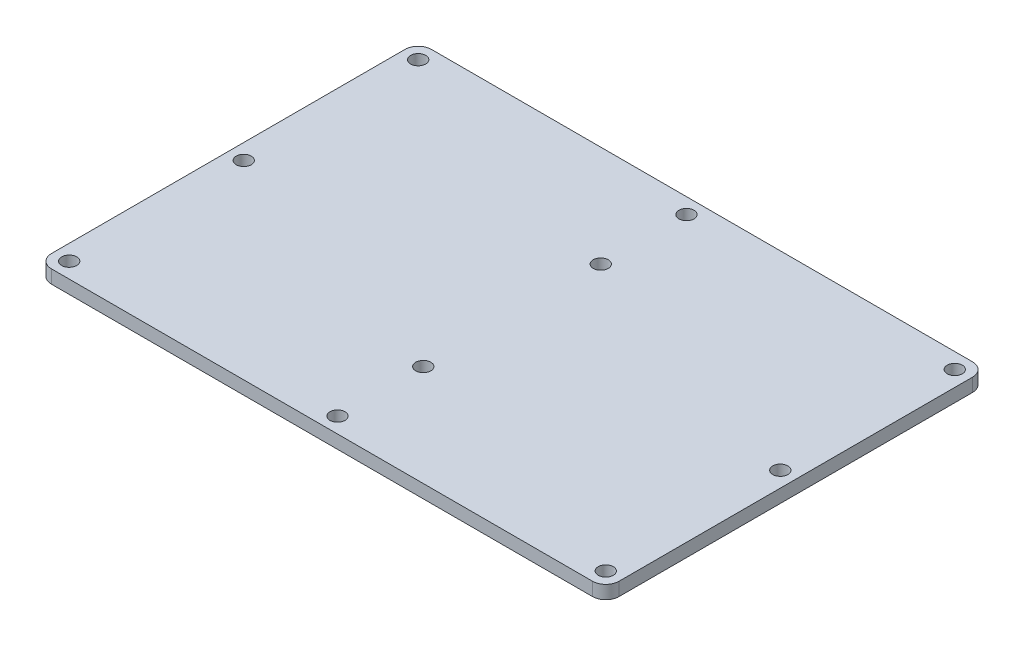
ISO-10303-21;
HEADER;
FILE_DESCRIPTION(('STEP AP214'),'2;1');
FILE_NAME('part.step','',(''),(''),'','','');
FILE_SCHEMA(('AUTOMOTIVE_DESIGN { 1 0 10303 214 1 1 1 1 }'));
ENDSEC;
DATA;
#1=APPLICATION_CONTEXT('core data for automotive mechanical design processes');
#2=APPLICATION_PROTOCOL_DEFINITION('international standard','automotive_design',2000,#1);
#3=PRODUCT_CONTEXT('',#1,'mechanical');
#4=PRODUCT('Part','Part','',(#3));
#5=PRODUCT_RELATED_PRODUCT_CATEGORY('part','',(#4));
#6=PRODUCT_DEFINITION_FORMATION('','',#4);
#7=PRODUCT_DEFINITION_CONTEXT('part definition',#1,'design');
#8=PRODUCT_DEFINITION('design','',#6,#7);
#9=PRODUCT_DEFINITION_SHAPE('','',#8);
#10=(LENGTH_UNIT() NAMED_UNIT(*) SI_UNIT(.MILLI.,.METRE.));
#11=(NAMED_UNIT(*) PLANE_ANGLE_UNIT() SI_UNIT($,.RADIAN.));
#12=(NAMED_UNIT(*) SI_UNIT($,.STERADIAN.) SOLID_ANGLE_UNIT());
#13=UNCERTAINTY_MEASURE_WITH_UNIT(LENGTH_MEASURE(1.E-05),#10,'distance_accuracy_value','');
#14=(GEOMETRIC_REPRESENTATION_CONTEXT(3) GLOBAL_UNCERTAINTY_ASSIGNED_CONTEXT((#13)) GLOBAL_UNIT_ASSIGNED_CONTEXT((#10,
#11,#12)) REPRESENTATION_CONTEXT('',''));
#15=CARTESIAN_POINT('',(0.,0.,0.));
#16=DIRECTION('',(0.,0.,1.));
#17=DIRECTION('',(1.,0.,0.));
#18=AXIS2_PLACEMENT_3D('',#15,#16,#17);
#19=CARTESIAN_POINT('',(0.,0.,0.));
#20=DIRECTION('',(0.,-1.,0.));
#21=DIRECTION('',(0.,0.,-1.));
#22=AXIS2_PLACEMENT_3D('',#19,#20,#21);
#23=PLANE('',#22);
#24=CARTESIAN_POINT('',(-60.5,0.,-39.35));
#25=DIRECTION('',(0.,1.,0.));
#26=DIRECTION('',(0.,0.,1.));
#27=AXIS2_PLACEMENT_3D('',#24,#25,#26);
#28=CIRCLE('',#27,1.7);
#29=CARTESIAN_POINT('',(-60.5,0.,-37.65));
#30=VERTEX_POINT('',#29);
#31=EDGE_CURVE('E282',#30,#30,#28,.T.);
#32=ORIENTED_EDGE('',*,*,#31,.T.);
#33=EDGE_LOOP('',(#32));
#34=FACE_BOUND('',#33,.T.);
#35=CARTESIAN_POINT('',(0.,0.,-39.35));
#36=DIRECTION('',(0.,1.,0.));
#37=DIRECTION('',(0.,0.,1.));
#38=AXIS2_PLACEMENT_3D('',#35,#36,#37);
#39=CIRCLE('',#38,1.7);
#40=CARTESIAN_POINT('',(0.,0.,-37.65));
#41=VERTEX_POINT('',#40);
#42=EDGE_CURVE('E274',#41,#41,#39,.T.);
#43=ORIENTED_EDGE('',*,*,#42,.T.);
#44=EDGE_LOOP('',(#43));
#45=FACE_BOUND('',#44,.T.);
#46=CARTESIAN_POINT('',(60.5,0.,-39.35));
#47=DIRECTION('',(0.,1.,0.));
#48=DIRECTION('',(0.,0.,1.));
#49=AXIS2_PLACEMENT_3D('',#46,#47,#48);
#50=CIRCLE('',#49,1.7);
#51=CARTESIAN_POINT('',(60.5,0.,-37.65));
#52=VERTEX_POINT('',#51);
#53=EDGE_CURVE('E266',#52,#52,#50,.T.);
#54=ORIENTED_EDGE('',*,*,#53,.T.);
#55=EDGE_LOOP('',(#54));
#56=FACE_BOUND('',#55,.T.);
#57=CARTESIAN_POINT('',(60.5,0.,0.));
#58=DIRECTION('',(0.,1.,0.));
#59=DIRECTION('',(0.,0.,1.));
#60=AXIS2_PLACEMENT_3D('',#57,#58,#59);
#61=CIRCLE('',#60,1.7);
#62=CARTESIAN_POINT('',(60.5,0.,1.7));
#63=VERTEX_POINT('',#62);
#64=EDGE_CURVE('E258',#63,#63,#61,.T.);
#65=ORIENTED_EDGE('',*,*,#64,.T.);
#66=EDGE_LOOP('',(#65));
#67=FACE_BOUND('',#66,.T.);
#68=CARTESIAN_POINT('',(60.5,0.,39.35));
#69=DIRECTION('',(0.,1.,0.));
#70=DIRECTION('',(0.,0.,1.));
#71=AXIS2_PLACEMENT_3D('',#68,#69,#70);
#72=CIRCLE('',#71,1.7);
#73=CARTESIAN_POINT('',(60.5,0.,41.05));
#74=VERTEX_POINT('',#73);
#75=EDGE_CURVE('E250',#74,#74,#72,.T.);
#76=ORIENTED_EDGE('',*,*,#75,.T.);
#77=EDGE_LOOP('',(#76));
#78=FACE_BOUND('',#77,.T.);
#79=CARTESIAN_POINT('',(0.,0.,39.35));
#80=DIRECTION('',(0.,1.,0.));
#81=DIRECTION('',(0.,0.,1.));
#82=AXIS2_PLACEMENT_3D('',#79,#80,#81);
#83=CIRCLE('',#82,1.7);
#84=CARTESIAN_POINT('',(0.,0.,41.05));
#85=VERTEX_POINT('',#84);
#86=EDGE_CURVE('E242',#85,#85,#83,.T.);
#87=ORIENTED_EDGE('',*,*,#86,.T.);
#88=EDGE_LOOP('',(#87));
#89=FACE_BOUND('',#88,.T.);
#90=CARTESIAN_POINT('',(-60.5,0.,39.35));
#91=DIRECTION('',(0.,1.,0.));
#92=DIRECTION('',(0.,0.,1.));
#93=AXIS2_PLACEMENT_3D('',#90,#91,#92);
#94=CIRCLE('',#93,1.7);
#95=CARTESIAN_POINT('',(-60.5,0.,41.05));
#96=VERTEX_POINT('',#95);
#97=EDGE_CURVE('E234',#96,#96,#94,.T.);
#98=ORIENTED_EDGE('',*,*,#97,.T.);
#99=EDGE_LOOP('',(#98));
#100=FACE_BOUND('',#99,.T.);
#101=DIRECTION('',(-1.,0.,0.));
#102=VECTOR('',#101,1.);
#103=CARTESIAN_POINT('',(-64.,0.,-42.85));
#104=LINE('',#103,#102);
#105=CARTESIAN_POINT('',(61.,0.,-42.85));
#106=VERTEX_POINT('',#105);
#107=CARTESIAN_POINT('',(-61.,0.,-42.85));
#108=VERTEX_POINT('',#107);
#109=EDGE_CURVE('E125',#106,#108,#104,.T.);
#110=ORIENTED_EDGE('',*,*,#109,.F.);
#111=CARTESIAN_POINT('',(61.,0.,-39.85));
#112=DIRECTION('',(0.,-1.,0.));
#113=DIRECTION('',(0.,0.,-1.));
#114=AXIS2_PLACEMENT_3D('',#111,#112,#113);
#115=CIRCLE('',#114,3.);
#116=CARTESIAN_POINT('',(64.,0.,-39.85));
#117=VERTEX_POINT('',#116);
#118=EDGE_CURVE('E107',#106,#117,#115,.T.);
#119=ORIENTED_EDGE('',*,*,#118,.T.);
#120=DIRECTION('',(0.,0.,-1.));
#121=VECTOR('',#120,1.);
#122=CARTESIAN_POINT('',(64.,0.,42.85));
#123=LINE('',#122,#121);
#124=CARTESIAN_POINT('',(64.,0.,39.85));
#125=VERTEX_POINT('',#124);
#126=EDGE_CURVE('E138',#125,#117,#123,.T.);
#127=ORIENTED_EDGE('',*,*,#126,.F.);
#128=CARTESIAN_POINT('',(61.,0.,39.85));
#129=DIRECTION('',(0.,-1.,0.));
#130=DIRECTION('',(0.,0.,-1.));
#131=AXIS2_PLACEMENT_3D('',#128,#129,#130);
#132=CIRCLE('',#131,3.);
#133=CARTESIAN_POINT('',(61.,0.,42.85));
#134=VERTEX_POINT('',#133);
#135=EDGE_CURVE('E119',#125,#134,#132,.T.);
#136=ORIENTED_EDGE('',*,*,#135,.T.);
#137=DIRECTION('',(1.,0.,0.));
#138=VECTOR('',#137,1.);
#139=CARTESIAN_POINT('',(-64.,0.,42.85));
#140=LINE('',#139,#138);
#141=CARTESIAN_POINT('',(-61.,0.,42.85));
#142=VERTEX_POINT('',#141);
#143=EDGE_CURVE('E143',#142,#134,#140,.T.);
#144=ORIENTED_EDGE('',*,*,#143,.F.);
#145=CARTESIAN_POINT('',(-61.,0.,39.85));
#146=DIRECTION('',(0.,-1.,0.));
#147=DIRECTION('',(0.,0.,-1.));
#148=AXIS2_PLACEMENT_3D('',#145,#146,#147);
#149=CIRCLE('',#148,3.);
#150=CARTESIAN_POINT('',(-64.,0.,39.85));
#151=VERTEX_POINT('',#150);
#152=EDGE_CURVE('E130',#142,#151,#149,.T.);
#153=ORIENTED_EDGE('',*,*,#152,.T.);
#154=DIRECTION('',(0.,0.,1.));
#155=VECTOR('',#154,1.);
#156=CARTESIAN_POINT('',(-64.,0.,42.85));
#157=LINE('',#156,#155);
#158=CARTESIAN_POINT('',(-64.,0.,-39.85));
#159=VERTEX_POINT('',#158);
#160=EDGE_CURVE('E137',#159,#151,#157,.T.);
#161=ORIENTED_EDGE('',*,*,#160,.F.);
#162=CARTESIAN_POINT('',(-61.,0.,-39.85));
#163=DIRECTION('',(0.,-1.,0.));
#164=DIRECTION('',(0.,0.,-1.));
#165=AXIS2_PLACEMENT_3D('',#162,#163,#164);
#166=CIRCLE('',#165,3.);
#167=EDGE_CURVE('E135',#159,#108,#166,.T.);
#168=ORIENTED_EDGE('',*,*,#167,.T.);
#169=EDGE_LOOP('',(#110,#119,#127,#136,#144,#153,#161,#168));
#170=FACE_BOUND('',#169,.T.);
#171=CARTESIAN_POINT('',(0.,0.,-20.01));
#172=DIRECTION('',(0.,1.,0.));
#173=DIRECTION('',(0.,0.,1.));
#174=AXIS2_PLACEMENT_3D('',#171,#172,#173);
#175=CIRCLE('',#174,1.7);
#176=CARTESIAN_POINT('',(0.,0.,-18.31));
#177=VERTEX_POINT('',#176);
#178=EDGE_CURVE('E145',#177,#177,#175,.T.);
#179=ORIENTED_EDGE('',*,*,#178,.T.);
#180=EDGE_LOOP('',(#179));
#181=FACE_BOUND('',#180,.T.);
#182=CARTESIAN_POINT('',(0.,0.,20.01));
#183=DIRECTION('',(0.,1.,0.));
#184=DIRECTION('',(0.,0.,1.));
#185=AXIS2_PLACEMENT_3D('',#182,#183,#184);
#186=CIRCLE('',#185,1.7);
#187=CARTESIAN_POINT('',(0.,0.,21.71));
#188=VERTEX_POINT('',#187);
#189=EDGE_CURVE('E218',#188,#188,#186,.T.);
#190=ORIENTED_EDGE('',*,*,#189,.T.);
#191=EDGE_LOOP('',(#190));
#192=FACE_BOUND('',#191,.T.);
#193=CARTESIAN_POINT('',(-60.5,0.,0.));
#194=DIRECTION('',(0.,1.,0.));
#195=DIRECTION('',(0.,0.,1.));
#196=AXIS2_PLACEMENT_3D('',#193,#194,#195);
#197=CIRCLE('',#196,1.7);
#198=CARTESIAN_POINT('',(-60.5,0.,1.7));
#199=VERTEX_POINT('',#198);
#200=EDGE_CURVE('E226',#199,#199,#197,.T.);
#201=ORIENTED_EDGE('',*,*,#200,.T.);
#202=EDGE_LOOP('',(#201));
#203=FACE_BOUND('',#202,.T.);
#204=ADVANCED_FACE('F39',(#34,#45,#56,#67,#78,#89,#100,#170,#181,#192,#203),#23,.T.);
#205=CARTESIAN_POINT('',(64.,3.,42.85));
#206=DIRECTION('',(-1.,0.,0.));
#207=DIRECTION('',(0.,0.,1.));
#208=AXIS2_PLACEMENT_3D('',#205,#206,#207);
#209=PLANE('',#208);
#210=ORIENTED_EDGE('',*,*,#126,.T.);
#211=DIRECTION('',(0.,-1.,0.));
#212=VECTOR('',#211,1.);
#213=CARTESIAN_POINT('',(64.,3.,-39.85));
#214=LINE('',#213,#212);
#215=CARTESIAN_POINT('',(64.,3.,-39.85));
#216=VERTEX_POINT('',#215);
#217=EDGE_CURVE('E112',#117,#216,#214,.F.);
#218=ORIENTED_EDGE('',*,*,#217,.T.);
#219=DIRECTION('',(0.,0.,-1.));
#220=VECTOR('',#219,1.);
#221=CARTESIAN_POINT('',(64.,3.,42.85));
#222=LINE('',#221,#220);
#223=CARTESIAN_POINT('',(64.,3.,39.85));
#224=VERTEX_POINT('',#223);
#225=EDGE_CURVE('E151',#224,#216,#222,.T.);
#226=ORIENTED_EDGE('',*,*,#225,.F.);
#227=DIRECTION('',(0.,-1.,0.));
#228=VECTOR('',#227,1.);
#229=CARTESIAN_POINT('',(64.,3.,39.85));
#230=LINE('',#229,#228);
#231=EDGE_CURVE('E118',#224,#125,#230,.T.);
#232=ORIENTED_EDGE('',*,*,#231,.T.);
#233=EDGE_LOOP('',(#210,#218,#226,#232));
#234=FACE_BOUND('',#233,.T.);
#235=ADVANCED_FACE('F204',(#234),#209,.F.);
#236=CARTESIAN_POINT('',(-64.,3.,-42.85));
#237=DIRECTION('',(0.,0.,1.));
#238=DIRECTION('',(1.,0.,0.));
#239=AXIS2_PLACEMENT_3D('',#236,#237,#238);
#240=PLANE('',#239);
#241=DIRECTION('',(-1.,0.,0.));
#242=VECTOR('',#241,1.);
#243=CARTESIAN_POINT('',(-64.,3.,-42.85));
#244=LINE('',#243,#242);
#245=CARTESIAN_POINT('',(61.,3.,-42.85));
#246=VERTEX_POINT('',#245);
#247=CARTESIAN_POINT('',(-61.,3.,-42.85));
#248=VERTEX_POINT('',#247);
#249=EDGE_CURVE('E128',#246,#248,#244,.T.);
#250=ORIENTED_EDGE('',*,*,#249,.F.);
#251=DIRECTION('',(0.,-1.,0.));
#252=VECTOR('',#251,1.);
#253=CARTESIAN_POINT('',(61.,3.,-42.85));
#254=LINE('',#253,#252);
#255=EDGE_CURVE('E111',#246,#106,#254,.T.);
#256=ORIENTED_EDGE('',*,*,#255,.T.);
#257=ORIENTED_EDGE('',*,*,#109,.T.);
#258=DIRECTION('',(0.,-1.,0.));
#259=VECTOR('',#258,1.);
#260=CARTESIAN_POINT('',(-61.,3.,-42.85));
#261=LINE('',#260,#259);
#262=EDGE_CURVE('E131',#108,#248,#261,.F.);
#263=ORIENTED_EDGE('',*,*,#262,.T.);
#264=EDGE_LOOP('',(#250,#256,#257,#263));
#265=FACE_BOUND('',#264,.T.);
#266=ADVANCED_FACE('F124',(#265),#240,.F.);
#267=CARTESIAN_POINT('',(-64.,3.,42.85));
#268=DIRECTION('',(1.,0.,0.));
#269=DIRECTION('',(0.,0.,-1.));
#270=AXIS2_PLACEMENT_3D('',#267,#268,#269);
#271=PLANE('',#270);
#272=DIRECTION('',(0.,0.,1.));
#273=VECTOR('',#272,1.);
#274=CARTESIAN_POINT('',(-64.,3.,42.85));
#275=LINE('',#274,#273);
#276=CARTESIAN_POINT('',(-64.,3.,-39.85));
#277=VERTEX_POINT('',#276);
#278=CARTESIAN_POINT('',(-64.,3.,39.85));
#279=VERTEX_POINT('',#278);
#280=EDGE_CURVE('E187',#277,#279,#275,.T.);
#281=ORIENTED_EDGE('',*,*,#280,.F.);
#282=DIRECTION('',(0.,-1.,0.));
#283=VECTOR('',#282,1.);
#284=CARTESIAN_POINT('',(-64.,3.,-39.85));
#285=LINE('',#284,#283);
#286=EDGE_CURVE('E11',#277,#159,#285,.T.);
#287=ORIENTED_EDGE('',*,*,#286,.T.);
#288=ORIENTED_EDGE('',*,*,#160,.T.);
#289=DIRECTION('',(0.,-1.,0.));
#290=VECTOR('',#289,1.);
#291=CARTESIAN_POINT('',(-64.,3.,39.85));
#292=LINE('',#291,#290);
#293=EDGE_CURVE('E48',#151,#279,#292,.F.);
#294=ORIENTED_EDGE('',*,*,#293,.T.);
#295=EDGE_LOOP('',(#281,#287,#288,#294));
#296=FACE_BOUND('',#295,.T.);
#297=ADVANCED_FACE('F186',(#296),#271,.F.);
#298=CARTESIAN_POINT('',(-64.,3.,42.85));
#299=DIRECTION('',(0.,0.,-1.));
#300=DIRECTION('',(-1.,0.,0.));
#301=AXIS2_PLACEMENT_3D('',#298,#299,#300);
#302=PLANE('',#301);
#303=ORIENTED_EDGE('',*,*,#143,.T.);
#304=DIRECTION('',(0.,-1.,0.));
#305=VECTOR('',#304,1.);
#306=CARTESIAN_POINT('',(61.,3.,42.85));
#307=LINE('',#306,#305);
#308=CARTESIAN_POINT('',(61.,3.,42.85));
#309=VERTEX_POINT('',#308);
#310=EDGE_CURVE('E55',#134,#309,#307,.F.);
#311=ORIENTED_EDGE('',*,*,#310,.T.);
#312=DIRECTION('',(1.,0.,0.));
#313=VECTOR('',#312,1.);
#314=CARTESIAN_POINT('',(-64.,3.,42.85));
#315=LINE('',#314,#313);
#316=CARTESIAN_POINT('',(-61.,3.,42.85));
#317=VERTEX_POINT('',#316);
#318=EDGE_CURVE('E153',#317,#309,#315,.T.);
#319=ORIENTED_EDGE('',*,*,#318,.F.);
#320=DIRECTION('',(0.,-1.,0.));
#321=VECTOR('',#320,1.);
#322=CARTESIAN_POINT('',(-61.,3.,42.85));
#323=LINE('',#322,#321);
#324=EDGE_CURVE('E177',#317,#142,#323,.T.);
#325=ORIENTED_EDGE('',*,*,#324,.T.);
#326=EDGE_LOOP('',(#303,#311,#319,#325));
#327=FACE_BOUND('',#326,.T.);
#328=ADVANCED_FACE('F197',(#327),#302,.F.);
#329=CARTESIAN_POINT('',(0.,3.,0.));
#330=DIRECTION('',(0.,-1.,0.));
#331=DIRECTION('',(0.,0.,-1.));
#332=AXIS2_PLACEMENT_3D('',#329,#330,#331);
#333=PLANE('',#332);
#334=CARTESIAN_POINT('',(-60.5,3.,-39.35));
#335=DIRECTION('',(0.,1.,0.));
#336=DIRECTION('',(0.,0.,1.));
#337=AXIS2_PLACEMENT_3D('',#334,#335,#336);
#338=CIRCLE('',#337,1.7);
#339=CARTESIAN_POINT('',(-60.5,3.,-37.65));
#340=VERTEX_POINT('',#339);
#341=EDGE_CURVE('E286',#340,#340,#338,.T.);
#342=ORIENTED_EDGE('',*,*,#341,.F.);
#343=EDGE_LOOP('',(#342));
#344=FACE_BOUND('',#343,.T.);
#345=CARTESIAN_POINT('',(0.,3.,-39.35));
#346=DIRECTION('',(0.,1.,0.));
#347=DIRECTION('',(0.,0.,1.));
#348=AXIS2_PLACEMENT_3D('',#345,#346,#347);
#349=CIRCLE('',#348,1.7);
#350=CARTESIAN_POINT('',(0.,3.,-37.65));
#351=VERTEX_POINT('',#350);
#352=EDGE_CURVE('E278',#351,#351,#349,.T.);
#353=ORIENTED_EDGE('',*,*,#352,.F.);
#354=EDGE_LOOP('',(#353));
#355=FACE_BOUND('',#354,.T.);
#356=CARTESIAN_POINT('',(60.5,3.,-39.35));
#357=DIRECTION('',(0.,1.,0.));
#358=DIRECTION('',(0.,0.,1.));
#359=AXIS2_PLACEMENT_3D('',#356,#357,#358);
#360=CIRCLE('',#359,1.7);
#361=CARTESIAN_POINT('',(60.5,3.,-37.65));
#362=VERTEX_POINT('',#361);
#363=EDGE_CURVE('E270',#362,#362,#360,.T.);
#364=ORIENTED_EDGE('',*,*,#363,.F.);
#365=EDGE_LOOP('',(#364));
#366=FACE_BOUND('',#365,.T.);
#367=CARTESIAN_POINT('',(60.5,3.,0.));
#368=DIRECTION('',(0.,1.,0.));
#369=DIRECTION('',(0.,0.,1.));
#370=AXIS2_PLACEMENT_3D('',#367,#368,#369);
#371=CIRCLE('',#370,1.7);
#372=CARTESIAN_POINT('',(60.5,3.,1.7));
#373=VERTEX_POINT('',#372);
#374=EDGE_CURVE('E262',#373,#373,#371,.T.);
#375=ORIENTED_EDGE('',*,*,#374,.F.);
#376=EDGE_LOOP('',(#375));
#377=FACE_BOUND('',#376,.T.);
#378=CARTESIAN_POINT('',(60.5,3.,39.35));
#379=DIRECTION('',(0.,1.,0.));
#380=DIRECTION('',(0.,0.,1.));
#381=AXIS2_PLACEMENT_3D('',#378,#379,#380);
#382=CIRCLE('',#381,1.7);
#383=CARTESIAN_POINT('',(60.5,3.,41.05));
#384=VERTEX_POINT('',#383);
#385=EDGE_CURVE('E254',#384,#384,#382,.T.);
#386=ORIENTED_EDGE('',*,*,#385,.F.);
#387=EDGE_LOOP('',(#386));
#388=FACE_BOUND('',#387,.T.);
#389=CARTESIAN_POINT('',(0.,3.,39.35));
#390=DIRECTION('',(0.,1.,0.));
#391=DIRECTION('',(0.,0.,1.));
#392=AXIS2_PLACEMENT_3D('',#389,#390,#391);
#393=CIRCLE('',#392,1.7);
#394=CARTESIAN_POINT('',(0.,3.,41.05));
#395=VERTEX_POINT('',#394);
#396=EDGE_CURVE('E246',#395,#395,#393,.T.);
#397=ORIENTED_EDGE('',*,*,#396,.F.);
#398=EDGE_LOOP('',(#397));
#399=FACE_BOUND('',#398,.T.);
#400=CARTESIAN_POINT('',(-60.5,3.,39.35));
#401=DIRECTION('',(0.,1.,0.));
#402=DIRECTION('',(0.,0.,1.));
#403=AXIS2_PLACEMENT_3D('',#400,#401,#402);
#404=CIRCLE('',#403,1.7);
#405=CARTESIAN_POINT('',(-60.5,3.,41.05));
#406=VERTEX_POINT('',#405);
#407=EDGE_CURVE('E238',#406,#406,#404,.T.);
#408=ORIENTED_EDGE('',*,*,#407,.F.);
#409=EDGE_LOOP('',(#408));
#410=FACE_BOUND('',#409,.T.);
#411=CARTESIAN_POINT('',(-60.5,3.,0.));
#412=DIRECTION('',(0.,1.,0.));
#413=DIRECTION('',(0.,0.,1.));
#414=AXIS2_PLACEMENT_3D('',#411,#412,#413);
#415=CIRCLE('',#414,1.7);
#416=CARTESIAN_POINT('',(-60.5,3.,1.7));
#417=VERTEX_POINT('',#416);
#418=EDGE_CURVE('E230',#417,#417,#415,.T.);
#419=ORIENTED_EDGE('',*,*,#418,.F.);
#420=EDGE_LOOP('',(#419));
#421=FACE_BOUND('',#420,.T.);
#422=CARTESIAN_POINT('',(0.,3.,20.01));
#423=DIRECTION('',(0.,1.,0.));
#424=DIRECTION('',(0.,0.,1.));
#425=AXIS2_PLACEMENT_3D('',#422,#423,#424);
#426=CIRCLE('',#425,1.7);
#427=CARTESIAN_POINT('',(0.,3.,21.71));
#428=VERTEX_POINT('',#427);
#429=EDGE_CURVE('E222',#428,#428,#426,.T.);
#430=ORIENTED_EDGE('',*,*,#429,.F.);
#431=EDGE_LOOP('',(#430));
#432=FACE_BOUND('',#431,.T.);
#433=CARTESIAN_POINT('',(0.,3.,-20.01));
#434=DIRECTION('',(0.,1.,0.));
#435=DIRECTION('',(0.,0.,1.));
#436=AXIS2_PLACEMENT_3D('',#433,#434,#435);
#437=CIRCLE('',#436,1.7);
#438=CARTESIAN_POINT('',(0.,3.,-18.31));
#439=VERTEX_POINT('',#438);
#440=EDGE_CURVE('E214',#439,#439,#437,.T.);
#441=ORIENTED_EDGE('',*,*,#440,.F.);
#442=EDGE_LOOP('',(#441));
#443=FACE_BOUND('',#442,.T.);
#444=ORIENTED_EDGE('',*,*,#225,.T.);
#445=CARTESIAN_POINT('',(61.,3.,-39.85));
#446=DIRECTION('',(0.,-1.,0.));
#447=DIRECTION('',(0.,0.,-1.));
#448=AXIS2_PLACEMENT_3D('',#445,#446,#447);
#449=CIRCLE('',#448,3.);
#450=EDGE_CURVE('E174',#216,#246,#449,.F.);
#451=ORIENTED_EDGE('',*,*,#450,.T.);
#452=ORIENTED_EDGE('',*,*,#249,.T.);
#453=CARTESIAN_POINT('',(-61.,3.,-39.85));
#454=DIRECTION('',(0.,-1.,0.));
#455=DIRECTION('',(0.,0.,-1.));
#456=AXIS2_PLACEMENT_3D('',#453,#454,#455);
#457=CIRCLE('',#456,3.);
#458=EDGE_CURVE('E168',#248,#277,#457,.F.);
#459=ORIENTED_EDGE('',*,*,#458,.T.);
#460=ORIENTED_EDGE('',*,*,#280,.T.);
#461=CARTESIAN_POINT('',(-61.,3.,39.85));
#462=DIRECTION('',(0.,-1.,0.));
#463=DIRECTION('',(0.,0.,-1.));
#464=AXIS2_PLACEMENT_3D('',#461,#462,#463);
#465=CIRCLE('',#464,3.);
#466=EDGE_CURVE('E62',#279,#317,#465,.F.);
#467=ORIENTED_EDGE('',*,*,#466,.T.);
#468=ORIENTED_EDGE('',*,*,#318,.T.);
#469=CARTESIAN_POINT('',(61.,3.,39.85));
#470=DIRECTION('',(0.,-1.,0.));
#471=DIRECTION('',(0.,0.,-1.));
#472=AXIS2_PLACEMENT_3D('',#469,#470,#471);
#473=CIRCLE('',#472,3.);
#474=EDGE_CURVE('E171',#309,#224,#473,.F.);
#475=ORIENTED_EDGE('',*,*,#474,.T.);
#476=EDGE_LOOP('',(#444,#451,#452,#459,#460,#467,#468,#475));
#477=FACE_BOUND('',#476,.T.);
#478=ADVANCED_FACE('F191',(#344,#355,#366,#377,#388,#399,#410,#421,#432,#443,#477),#333,.F.);
#479=CARTESIAN_POINT('',(0.,3.,-20.01));
#480=DIRECTION('',(0.,1.,0.));
#481=DIRECTION('',(0.,0.,1.));
#482=AXIS2_PLACEMENT_3D('',#479,#480,#481);
#483=CYLINDRICAL_SURFACE('',#482,1.7);
#484=ORIENTED_EDGE('',*,*,#178,.F.);
#485=EDGE_LOOP('',(#484));
#486=FACE_BOUND('',#485,.T.);
#487=ORIENTED_EDGE('',*,*,#440,.T.);
#488=EDGE_LOOP('',(#487));
#489=FACE_BOUND('',#488,.T.);
#490=ADVANCED_FACE('F295',(#486,#489),#483,.F.);
#491=CARTESIAN_POINT('',(0.,3.,20.01));
#492=DIRECTION('',(0.,1.,0.));
#493=DIRECTION('',(0.,0.,1.));
#494=AXIS2_PLACEMENT_3D('',#491,#492,#493);
#495=CYLINDRICAL_SURFACE('',#494,1.7);
#496=ORIENTED_EDGE('',*,*,#189,.F.);
#497=EDGE_LOOP('',(#496));
#498=FACE_BOUND('',#497,.T.);
#499=ORIENTED_EDGE('',*,*,#429,.T.);
#500=EDGE_LOOP('',(#499));
#501=FACE_BOUND('',#500,.T.);
#502=ADVANCED_FACE('F316',(#498,#501),#495,.F.);
#503=CARTESIAN_POINT('',(-60.5,3.,0.));
#504=DIRECTION('',(0.,1.,0.));
#505=DIRECTION('',(0.,0.,1.));
#506=AXIS2_PLACEMENT_3D('',#503,#504,#505);
#507=CYLINDRICAL_SURFACE('',#506,1.7);
#508=ORIENTED_EDGE('',*,*,#200,.F.);
#509=EDGE_LOOP('',(#508));
#510=FACE_BOUND('',#509,.T.);
#511=ORIENTED_EDGE('',*,*,#418,.T.);
#512=EDGE_LOOP('',(#511));
#513=FACE_BOUND('',#512,.T.);
#514=ADVANCED_FACE('F322',(#510,#513),#507,.F.);
#515=CARTESIAN_POINT('',(-60.5,3.,39.35));
#516=DIRECTION('',(0.,1.,0.));
#517=DIRECTION('',(0.,0.,1.));
#518=AXIS2_PLACEMENT_3D('',#515,#516,#517);
#519=CYLINDRICAL_SURFACE('',#518,1.7);
#520=ORIENTED_EDGE('',*,*,#97,.F.);
#521=EDGE_LOOP('',(#520));
#522=FACE_BOUND('',#521,.T.);
#523=ORIENTED_EDGE('',*,*,#407,.T.);
#524=EDGE_LOOP('',(#523));
#525=FACE_BOUND('',#524,.T.);
#526=ADVANCED_FACE('F462',(#522,#525),#519,.F.);
#527=CARTESIAN_POINT('',(0.,3.,39.35));
#528=DIRECTION('',(0.,1.,0.));
#529=DIRECTION('',(0.,0.,1.));
#530=AXIS2_PLACEMENT_3D('',#527,#528,#529);
#531=CYLINDRICAL_SURFACE('',#530,1.7);
#532=ORIENTED_EDGE('',*,*,#86,.F.);
#533=EDGE_LOOP('',(#532));
#534=FACE_BOUND('',#533,.T.);
#535=ORIENTED_EDGE('',*,*,#396,.T.);
#536=EDGE_LOOP('',(#535));
#537=FACE_BOUND('',#536,.T.);
#538=ADVANCED_FACE('F452',(#534,#537),#531,.F.);
#539=CARTESIAN_POINT('',(60.5,3.,39.35));
#540=DIRECTION('',(0.,1.,0.));
#541=DIRECTION('',(0.,0.,1.));
#542=AXIS2_PLACEMENT_3D('',#539,#540,#541);
#543=CYLINDRICAL_SURFACE('',#542,1.7);
#544=ORIENTED_EDGE('',*,*,#75,.F.);
#545=EDGE_LOOP('',(#544));
#546=FACE_BOUND('',#545,.T.);
#547=ORIENTED_EDGE('',*,*,#385,.T.);
#548=EDGE_LOOP('',(#547));
#549=FACE_BOUND('',#548,.T.);
#550=ADVANCED_FACE('F442',(#546,#549),#543,.F.);
#551=CARTESIAN_POINT('',(60.5,3.,0.));
#552=DIRECTION('',(0.,1.,0.));
#553=DIRECTION('',(0.,0.,1.));
#554=AXIS2_PLACEMENT_3D('',#551,#552,#553);
#555=CYLINDRICAL_SURFACE('',#554,1.7);
#556=ORIENTED_EDGE('',*,*,#64,.F.);
#557=EDGE_LOOP('',(#556));
#558=FACE_BOUND('',#557,.T.);
#559=ORIENTED_EDGE('',*,*,#374,.T.);
#560=EDGE_LOOP('',(#559));
#561=FACE_BOUND('',#560,.T.);
#562=ADVANCED_FACE('F432',(#558,#561),#555,.F.);
#563=CARTESIAN_POINT('',(60.5,3.,-39.35));
#564=DIRECTION('',(0.,1.,0.));
#565=DIRECTION('',(0.,0.,1.));
#566=AXIS2_PLACEMENT_3D('',#563,#564,#565);
#567=CYLINDRICAL_SURFACE('',#566,1.7);
#568=ORIENTED_EDGE('',*,*,#53,.F.);
#569=EDGE_LOOP('',(#568));
#570=FACE_BOUND('',#569,.T.);
#571=ORIENTED_EDGE('',*,*,#363,.T.);
#572=EDGE_LOOP('',(#571));
#573=FACE_BOUND('',#572,.T.);
#574=ADVANCED_FACE('F422',(#570,#573),#567,.F.);
#575=CARTESIAN_POINT('',(0.,3.,-39.35));
#576=DIRECTION('',(0.,1.,0.));
#577=DIRECTION('',(0.,0.,1.));
#578=AXIS2_PLACEMENT_3D('',#575,#576,#577);
#579=CYLINDRICAL_SURFACE('',#578,1.7);
#580=ORIENTED_EDGE('',*,*,#42,.F.);
#581=EDGE_LOOP('',(#580));
#582=FACE_BOUND('',#581,.T.);
#583=ORIENTED_EDGE('',*,*,#352,.T.);
#584=EDGE_LOOP('',(#583));
#585=FACE_BOUND('',#584,.T.);
#586=ADVANCED_FACE('F412',(#582,#585),#579,.F.);
#587=CARTESIAN_POINT('',(-60.5,3.,-39.35));
#588=DIRECTION('',(0.,1.,0.));
#589=DIRECTION('',(0.,0.,1.));
#590=AXIS2_PLACEMENT_3D('',#587,#588,#589);
#591=CYLINDRICAL_SURFACE('',#590,1.7);
#592=ORIENTED_EDGE('',*,*,#31,.F.);
#593=EDGE_LOOP('',(#592));
#594=FACE_BOUND('',#593,.T.);
#595=ORIENTED_EDGE('',*,*,#341,.T.);
#596=EDGE_LOOP('',(#595));
#597=FACE_BOUND('',#596,.T.);
#598=ADVANCED_FACE('F291',(#594,#597),#591,.F.);
#599=CARTESIAN_POINT('',(61.,3.,-39.85));
#600=DIRECTION('',(0.,-1.,0.));
#601=DIRECTION('',(0.,0.,-1.));
#602=AXIS2_PLACEMENT_3D('',#599,#600,#601);
#603=CYLINDRICAL_SURFACE('',#602,3.);
#604=ORIENTED_EDGE('',*,*,#450,.F.);
#605=ORIENTED_EDGE('',*,*,#217,.F.);
#606=ORIENTED_EDGE('',*,*,#118,.F.);
#607=ORIENTED_EDGE('',*,*,#255,.F.);
#608=EDGE_LOOP('',(#604,#605,#606,#607));
#609=FACE_BOUND('',#608,.T.);
#610=ADVANCED_FACE('F110',(#609),#603,.T.);
#611=CARTESIAN_POINT('',(61.,3.,39.85));
#612=DIRECTION('',(0.,-1.,0.));
#613=DIRECTION('',(0.,0.,-1.));
#614=AXIS2_PLACEMENT_3D('',#611,#612,#613);
#615=CYLINDRICAL_SURFACE('',#614,3.);
#616=ORIENTED_EDGE('',*,*,#474,.F.);
#617=ORIENTED_EDGE('',*,*,#310,.F.);
#618=ORIENTED_EDGE('',*,*,#135,.F.);
#619=ORIENTED_EDGE('',*,*,#231,.F.);
#620=EDGE_LOOP('',(#616,#617,#618,#619));
#621=FACE_BOUND('',#620,.T.);
#622=ADVANCED_FACE('F201',(#621),#615,.T.);
#623=CARTESIAN_POINT('',(-61.,3.,-39.85));
#624=DIRECTION('',(0.,-1.,0.));
#625=DIRECTION('',(0.,0.,-1.));
#626=AXIS2_PLACEMENT_3D('',#623,#624,#625);
#627=CYLINDRICAL_SURFACE('',#626,3.);
#628=ORIENTED_EDGE('',*,*,#458,.F.);
#629=ORIENTED_EDGE('',*,*,#262,.F.);
#630=ORIENTED_EDGE('',*,*,#167,.F.);
#631=ORIENTED_EDGE('',*,*,#286,.F.);
#632=EDGE_LOOP('',(#628,#629,#630,#631));
#633=FACE_BOUND('',#632,.T.);
#634=ADVANCED_FACE('F344',(#633),#627,.T.);
#635=CARTESIAN_POINT('',(-61.,3.,39.85));
#636=DIRECTION('',(0.,-1.,0.));
#637=DIRECTION('',(0.,0.,-1.));
#638=AXIS2_PLACEMENT_3D('',#635,#636,#637);
#639=CYLINDRICAL_SURFACE('',#638,3.);
#640=ORIENTED_EDGE('',*,*,#466,.F.);
#641=ORIENTED_EDGE('',*,*,#293,.F.);
#642=ORIENTED_EDGE('',*,*,#152,.F.);
#643=ORIENTED_EDGE('',*,*,#324,.F.);
#644=EDGE_LOOP('',(#640,#641,#642,#643));
#645=FACE_BOUND('',#644,.T.);
#646=ADVANCED_FACE('F41',(#645),#639,.T.);
#647=CLOSED_SHELL('',(#204,#235,#266,#297,#328,#478,#490,#502,#514,#526,#538,#550,#562,#574,
#586,#598,#610,#622,#634,#646));
#648=MANIFOLD_SOLID_BREP('B2',#647);
#649=ADVANCED_BREP_SHAPE_REPRESENTATION('',(#18,#648),#14);
#650=SHAPE_DEFINITION_REPRESENTATION(#9,#649);
ENDSEC;
END-ISO-10303-21;
